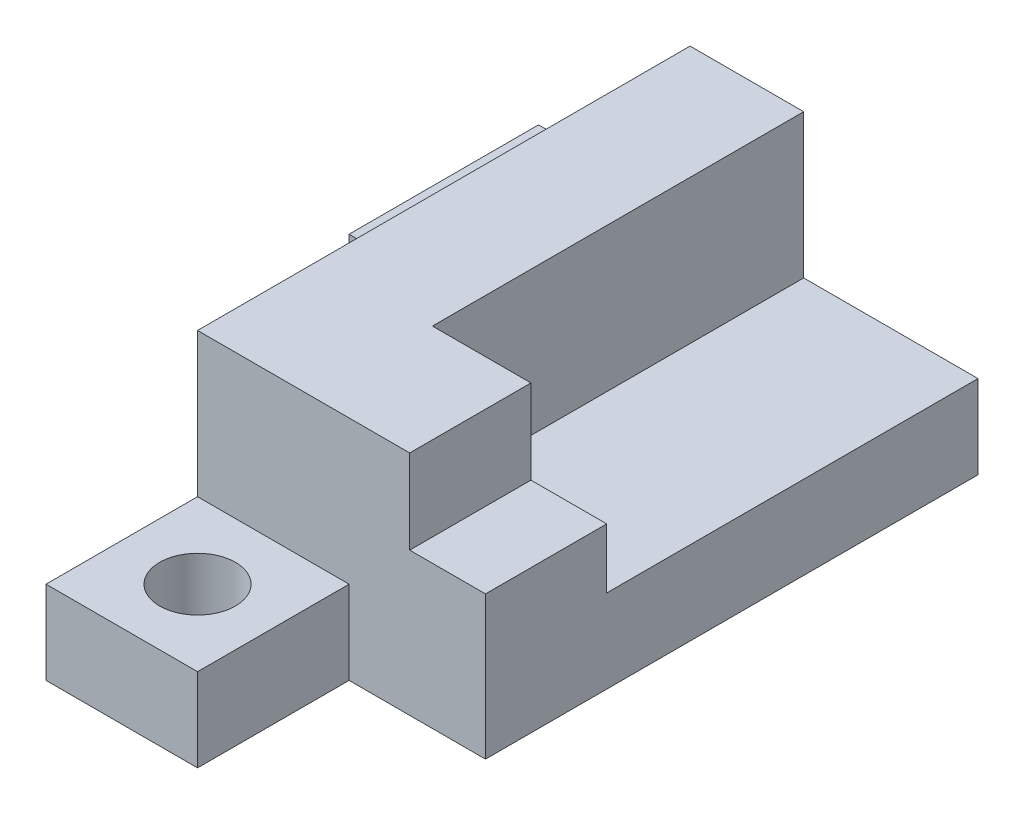
ISO-10303-21;
HEADER;
FILE_DESCRIPTION(('STEP AP214'),'2;1');
FILE_NAME('part.step','',(''),(''),'','','');
FILE_SCHEMA(('AUTOMOTIVE_DESIGN { 1 0 10303 214 1 1 1 1 }'));
ENDSEC;
DATA;
#1=APPLICATION_CONTEXT('core data for automotive mechanical design processes');
#2=APPLICATION_PROTOCOL_DEFINITION('international standard','automotive_design',2000,#1);
#3=PRODUCT_CONTEXT('',#1,'mechanical');
#4=PRODUCT('Part','Part','',(#3));
#5=PRODUCT_RELATED_PRODUCT_CATEGORY('part','',(#4));
#6=PRODUCT_DEFINITION_FORMATION('','',#4);
#7=PRODUCT_DEFINITION_CONTEXT('part definition',#1,'design');
#8=PRODUCT_DEFINITION('design','',#6,#7);
#9=PRODUCT_DEFINITION_SHAPE('','',#8);
#10=(LENGTH_UNIT() NAMED_UNIT(*) SI_UNIT(.MILLI.,.METRE.));
#11=(NAMED_UNIT(*) PLANE_ANGLE_UNIT() SI_UNIT($,.RADIAN.));
#12=(NAMED_UNIT(*) SI_UNIT($,.STERADIAN.) SOLID_ANGLE_UNIT());
#13=UNCERTAINTY_MEASURE_WITH_UNIT(LENGTH_MEASURE(1.E-05),#10,'distance_accuracy_value','');
#14=(GEOMETRIC_REPRESENTATION_CONTEXT(3) GLOBAL_UNCERTAINTY_ASSIGNED_CONTEXT((#13)) GLOBAL_UNIT_ASSIGNED_CONTEXT((#10,
#11,#12)) REPRESENTATION_CONTEXT('',''));
#15=CARTESIAN_POINT('',(0.,0.,0.));
#16=DIRECTION('',(0.,0.,1.));
#17=DIRECTION('',(1.,0.,0.));
#18=AXIS2_PLACEMENT_3D('',#15,#16,#17);
#19=CARTESIAN_POINT('',(-184.5,30.,-35.));
#20=DIRECTION('',(0.,0.,-1.));
#21=DIRECTION('',(-1.,0.,0.));
#22=AXIS2_PLACEMENT_3D('',#19,#20,#21);
#23=PLANE('',#22);
#24=DIRECTION('',(-1.,0.,0.));
#25=VECTOR('',#24,1.);
#26=CARTESIAN_POINT('',(-184.5,11.,-35.));
#27=LINE('',#26,#25);
#28=CARTESIAN_POINT('',(-164.5,11.,-35.));
#29=VERTEX_POINT('',#28);
#30=CARTESIAN_POINT('',(-184.5,11.,-35.));
#31=VERTEX_POINT('',#30);
#32=EDGE_CURVE('E269',#29,#31,#27,.T.);
#33=ORIENTED_EDGE('',*,*,#32,.F.);
#34=DIRECTION('',(0.,1.,0.));
#35=VECTOR('',#34,1.);
#36=CARTESIAN_POINT('',(-164.5,0.,-35.));
#37=LINE('',#36,#35);
#38=CARTESIAN_POINT('',(-164.5,0.,-35.));
#39=VERTEX_POINT('',#38);
#40=EDGE_CURVE('E54',#39,#29,#37,.T.);
#41=ORIENTED_EDGE('',*,*,#40,.F.);
#42=DIRECTION('',(1.,0.,0.));
#43=VECTOR('',#42,1.);
#44=CARTESIAN_POINT('',(0.,0.,-35.));
#45=LINE('',#44,#43);
#46=CARTESIAN_POINT('',(-146.5,0.,-35.));
#47=VERTEX_POINT('',#46);
#48=EDGE_CURVE('E219',#39,#47,#45,.T.);
#49=ORIENTED_EDGE('',*,*,#48,.T.);
#50=DIRECTION('',(0.,1.,0.));
#51=VECTOR('',#50,1.);
#52=CARTESIAN_POINT('',(-146.5,-190.,-35.));
#53=LINE('',#52,#51);
#54=CARTESIAN_POINT('',(-146.5,18.89,-35.));
#55=VERTEX_POINT('',#54);
#56=EDGE_CURVE('E217',#47,#55,#53,.T.);
#57=ORIENTED_EDGE('',*,*,#56,.T.);
#58=DIRECTION('',(1.,0.,0.));
#59=VECTOR('',#58,1.);
#60=CARTESIAN_POINT('',(-146.5,18.89,-35.));
#61=LINE('',#60,#59);
#62=CARTESIAN_POINT('',(-156.5,18.89,-35.));
#63=VERTEX_POINT('',#62);
#64=EDGE_CURVE('E203',#63,#55,#61,.T.);
#65=ORIENTED_EDGE('',*,*,#64,.F.);
#66=DIRECTION('',(0.,-1.,0.));
#67=VECTOR('',#66,1.);
#68=CARTESIAN_POINT('',(-156.5,30.,-35.));
#69=LINE('',#68,#67);
#70=CARTESIAN_POINT('',(-156.5,30.,-35.));
#71=VERTEX_POINT('',#70);
#72=EDGE_CURVE('E194',#71,#63,#69,.T.);
#73=ORIENTED_EDGE('',*,*,#72,.F.);
#74=DIRECTION('',(1.,0.,0.));
#75=VECTOR('',#74,1.);
#76=CARTESIAN_POINT('',(-184.5,30.,-35.));
#77=LINE('',#76,#75);
#78=CARTESIAN_POINT('',(-184.5,30.,-35.));
#79=VERTEX_POINT('',#78);
#80=EDGE_CURVE('E234',#79,#71,#77,.T.);
#81=ORIENTED_EDGE('',*,*,#80,.F.);
#82=DIRECTION('',(0.,-1.,0.));
#83=VECTOR('',#82,1.);
#84=CARTESIAN_POINT('',(-184.5,30.,-35.));
#85=LINE('',#84,#83);
#86=EDGE_CURVE('E60',#79,#31,#85,.T.);
#87=ORIENTED_EDGE('',*,*,#86,.T.);
#88=EDGE_LOOP('',(#33,#41,#49,#57,#65,#73,#81,#87));
#89=FACE_BOUND('',#88,.T.);
#90=ADVANCED_FACE('F39',(#89),#23,.F.);
#91=CARTESIAN_POINT('',(-184.5,20.,100.));
#92=DIRECTION('',(1.,0.,0.));
#93=DIRECTION('',(0.,0.,-1.));
#94=AXIS2_PLACEMENT_3D('',#91,#92,#93);
#95=PLANE('',#94);
#96=DIRECTION('',(0.,0.,-1.));
#97=VECTOR('',#96,1.);
#98=CARTESIAN_POINT('',(-184.5,11.,-75.));
#99=LINE('',#98,#97);
#100=CARTESIAN_POINT('',(-184.5,11.,-75.));
#101=VERTEX_POINT('',#100);
#102=CARTESIAN_POINT('',(-184.5,11.,-100.));
#103=VERTEX_POINT('',#102);
#104=EDGE_CURVE('E149',#101,#103,#99,.T.);
#105=ORIENTED_EDGE('',*,*,#104,.F.);
#106=DIRECTION('',(0.,1.,0.));
#107=VECTOR('',#106,1.);
#108=CARTESIAN_POINT('',(-184.5,0.,-75.));
#109=LINE('',#108,#107);
#110=CARTESIAN_POINT('',(-184.5,0.,-75.));
#111=VERTEX_POINT('',#110);
#112=EDGE_CURVE('E171',#111,#101,#109,.T.);
#113=ORIENTED_EDGE('',*,*,#112,.F.);
#114=DIRECTION('',(0.,0.,1.));
#115=VECTOR('',#114,1.);
#116=CARTESIAN_POINT('',(-184.5,0.,100.));
#117=LINE('',#116,#115);
#118=CARTESIAN_POINT('',(-184.5,0.,-15.));
#119=VERTEX_POINT('',#118);
#120=EDGE_CURVE('E155',#111,#119,#117,.T.);
#121=ORIENTED_EDGE('',*,*,#120,.T.);
#122=DIRECTION('',(0.,1.,0.));
#123=VECTOR('',#122,1.);
#124=CARTESIAN_POINT('',(-184.5,0.,-15.));
#125=LINE('',#124,#123);
#126=CARTESIAN_POINT('',(-184.5,11.,-15.));
#127=VERTEX_POINT('',#126);
#128=EDGE_CURVE('E240',#119,#127,#125,.T.);
#129=ORIENTED_EDGE('',*,*,#128,.T.);
#130=DIRECTION('',(0.,0.,1.));
#131=VECTOR('',#130,1.);
#132=CARTESIAN_POINT('',(-184.5,11.,-35.));
#133=LINE('',#132,#131);
#134=EDGE_CURVE('E272',#31,#127,#133,.T.);
#135=ORIENTED_EDGE('',*,*,#134,.F.);
#136=ORIENTED_EDGE('',*,*,#86,.F.);
#137=DIRECTION('',(0.,0.,1.));
#138=VECTOR('',#137,1.);
#139=CARTESIAN_POINT('',(-184.5,30.,-100.));
#140=LINE('',#139,#138);
#141=CARTESIAN_POINT('',(-184.5,30.,-100.));
#142=VERTEX_POINT('',#141);
#143=EDGE_CURVE('E152',#142,#79,#140,.T.);
#144=ORIENTED_EDGE('',*,*,#143,.F.);
#145=DIRECTION('',(0.,-1.,0.));
#146=VECTOR('',#145,1.);
#147=CARTESIAN_POINT('',(-184.5,20.,-100.));
#148=LINE('',#147,#146);
#149=EDGE_CURVE('E47',#142,#103,#148,.T.);
#150=ORIENTED_EDGE('',*,*,#149,.T.);
#151=EDGE_LOOP('',(#105,#113,#121,#129,#135,#136,#144,#150));
#152=FACE_BOUND('',#151,.T.);
#153=ADVANCED_FACE('F146',(#152),#95,.F.);
#154=CARTESIAN_POINT('',(-184.5,20.,-100.));
#155=DIRECTION('',(0.,0.,1.));
#156=DIRECTION('',(1.,0.,0.));
#157=AXIS2_PLACEMENT_3D('',#154,#155,#156);
#158=PLANE('',#157);
#159=DIRECTION('',(1.,0.,0.));
#160=VECTOR('',#159,1.);
#161=CARTESIAN_POINT('',(-146.5,11.,-100.));
#162=LINE('',#161,#160);
#163=CARTESIAN_POINT('',(-169.5,11.,-100.));
#164=VERTEX_POINT('',#163);
#165=CARTESIAN_POINT('',(-146.5,11.,-100.));
#166=VERTEX_POINT('',#165);
#167=EDGE_CURVE('E188',#164,#166,#162,.T.);
#168=ORIENTED_EDGE('',*,*,#167,.T.);
#169=DIRECTION('',(0.,-1.,0.));
#170=VECTOR('',#169,1.);
#171=CARTESIAN_POINT('',(-146.5,20.,-100.));
#172=LINE('',#171,#170);
#173=CARTESIAN_POINT('',(-146.5,0.,-100.));
#174=VERTEX_POINT('',#173);
#175=EDGE_CURVE('E224',#166,#174,#172,.T.);
#176=ORIENTED_EDGE('',*,*,#175,.T.);
#177=DIRECTION('',(-1.,0.,0.));
#178=VECTOR('',#177,1.);
#179=CARTESIAN_POINT('',(-184.5,0.,-100.));
#180=LINE('',#179,#178);
#181=CARTESIAN_POINT('',(-204.5,0.,-100.));
#182=VERTEX_POINT('',#181);
#183=EDGE_CURVE('E237',#174,#182,#180,.T.);
#184=ORIENTED_EDGE('',*,*,#183,.T.);
#185=DIRECTION('',(0.,-1.,0.));
#186=VECTOR('',#185,1.);
#187=CARTESIAN_POINT('',(-204.5,11.,-100.));
#188=LINE('',#187,#186);
#189=CARTESIAN_POINT('',(-204.5,11.,-100.));
#190=VERTEX_POINT('',#189);
#191=EDGE_CURVE('E160',#190,#182,#188,.T.);
#192=ORIENTED_EDGE('',*,*,#191,.F.);
#193=DIRECTION('',(1.,0.,0.));
#194=VECTOR('',#193,1.);
#195=CARTESIAN_POINT('',(-204.5,11.,-100.));
#196=LINE('',#195,#194);
#197=EDGE_CURVE('E157',#190,#103,#196,.T.);
#198=ORIENTED_EDGE('',*,*,#197,.T.);
#199=ORIENTED_EDGE('',*,*,#149,.F.);
#200=DIRECTION('',(-1.,0.,0.));
#201=VECTOR('',#200,1.);
#202=CARTESIAN_POINT('',(-169.5,30.,-100.));
#203=LINE('',#202,#201);
#204=CARTESIAN_POINT('',(-169.5,30.,-100.));
#205=VERTEX_POINT('',#204);
#206=EDGE_CURVE('E230',#205,#142,#203,.T.);
#207=ORIENTED_EDGE('',*,*,#206,.F.);
#208=DIRECTION('',(0.,1.,0.));
#209=VECTOR('',#208,1.);
#210=CARTESIAN_POINT('',(-169.5,-5.76305461424021,-100.));
#211=LINE('',#210,#209);
#212=EDGE_CURVE('E164',#164,#205,#211,.T.);
#213=ORIENTED_EDGE('',*,*,#212,.F.);
#214=EDGE_LOOP('',(#168,#176,#184,#192,#198,#199,#207,#213));
#215=FACE_BOUND('',#214,.T.);
#216=ADVANCED_FACE('F41',(#215),#158,.F.);
#217=CARTESIAN_POINT('',(0.,30.,0.));
#218=DIRECTION('',(0.,1.,0.));
#219=DIRECTION('',(0.,0.,1.));
#220=AXIS2_PLACEMENT_3D('',#217,#218,#219);
#221=PLANE('',#220);
#222=DIRECTION('',(0.,0.,-1.));
#223=VECTOR('',#222,1.);
#224=CARTESIAN_POINT('',(-169.5,30.,-84.));
#225=LINE('',#224,#223);
#226=CARTESIAN_POINT('',(-169.5,30.,-51.));
#227=VERTEX_POINT('',#226);
#228=EDGE_CURVE('E232',#227,#205,#225,.T.);
#229=ORIENTED_EDGE('',*,*,#228,.T.);
#230=ORIENTED_EDGE('',*,*,#206,.T.);
#231=ORIENTED_EDGE('',*,*,#143,.T.);
#232=ORIENTED_EDGE('',*,*,#80,.T.);
#233=DIRECTION('',(0.,0.,1.));
#234=VECTOR('',#233,1.);
#235=CARTESIAN_POINT('',(-156.5,30.,-51.));
#236=LINE('',#235,#234);
#237=CARTESIAN_POINT('',(-156.5,30.,-51.));
#238=VERTEX_POINT('',#237);
#239=EDGE_CURVE('E191',#238,#71,#236,.T.);
#240=ORIENTED_EDGE('',*,*,#239,.F.);
#241=DIRECTION('',(-1.,0.,0.));
#242=VECTOR('',#241,1.);
#243=CARTESIAN_POINT('',(-156.5,30.,-51.));
#244=LINE('',#243,#242);
#245=EDGE_CURVE('E198',#238,#227,#244,.T.);
#246=ORIENTED_EDGE('',*,*,#245,.T.);
#247=EDGE_LOOP('',(#229,#230,#231,#232,#240,#246));
#248=FACE_BOUND('',#247,.T.);
#249=ADVANCED_FACE('F324',(#248),#221,.T.);
#250=CARTESIAN_POINT('',(-146.5,-39.,-161.504576805052));
#251=DIRECTION('',(-1.,0.,0.));
#252=DIRECTION('',(0.,0.,1.));
#253=AXIS2_PLACEMENT_3D('',#250,#251,#252);
#254=PLANE('',#253);
#255=ORIENTED_EDGE('',*,*,#175,.F.);
#256=DIRECTION('',(0.,0.,1.));
#257=VECTOR('',#256,1.);
#258=CARTESIAN_POINT('',(-146.5,11.,0.));
#259=LINE('',#258,#257);
#260=CARTESIAN_POINT('',(-146.5,11.,-51.));
#261=VERTEX_POINT('',#260);
#262=EDGE_CURVE('E11',#166,#261,#259,.T.);
#263=ORIENTED_EDGE('',*,*,#262,.T.);
#264=DIRECTION('',(0.,-1.,0.));
#265=VECTOR('',#264,1.);
#266=CARTESIAN_POINT('',(-146.5,18.89,-51.));
#267=LINE('',#266,#265);
#268=CARTESIAN_POINT('',(-146.5,18.89,-51.));
#269=VERTEX_POINT('',#268);
#270=EDGE_CURVE('E214',#269,#261,#267,.T.);
#271=ORIENTED_EDGE('',*,*,#270,.F.);
#272=DIRECTION('',(0.,0.,-1.));
#273=VECTOR('',#272,1.);
#274=CARTESIAN_POINT('',(-146.5,18.89,-51.));
#275=LINE('',#274,#273);
#276=EDGE_CURVE('E206',#55,#269,#275,.T.);
#277=ORIENTED_EDGE('',*,*,#276,.F.);
#278=ORIENTED_EDGE('',*,*,#56,.F.);
#279=DIRECTION('',(0.,0.,-1.));
#280=VECTOR('',#279,1.);
#281=CARTESIAN_POINT('',(-146.5,0.,0.));
#282=LINE('',#281,#280);
#283=EDGE_CURVE('E221',#47,#174,#282,.T.);
#284=ORIENTED_EDGE('',*,*,#283,.T.);
#285=EDGE_LOOP('',(#255,#263,#271,#277,#278,#284));
#286=FACE_BOUND('',#285,.T.);
#287=ADVANCED_FACE('F293',(#286),#254,.F.);
#288=CARTESIAN_POINT('',(-169.5,30.,84.));
#289=DIRECTION('',(-1.,0.,0.));
#290=DIRECTION('',(0.,0.,1.));
#291=AXIS2_PLACEMENT_3D('',#288,#289,#290);
#292=PLANE('',#291);
#293=DIRECTION('',(0.,1.,0.));
#294=VECTOR('',#293,1.);
#295=CARTESIAN_POINT('',(-169.5,11.,-51.));
#296=LINE('',#295,#294);
#297=CARTESIAN_POINT('',(-169.5,11.,-51.));
#298=VERTEX_POINT('',#297);
#299=EDGE_CURVE('E190',#298,#227,#296,.T.);
#300=ORIENTED_EDGE('',*,*,#299,.F.);
#301=DIRECTION('',(0.,0.,1.));
#302=VECTOR('',#301,1.);
#303=CARTESIAN_POINT('',(-169.5,11.,-84.));
#304=LINE('',#303,#302);
#305=EDGE_CURVE('E226',#164,#298,#304,.T.);
#306=ORIENTED_EDGE('',*,*,#305,.F.);
#307=ORIENTED_EDGE('',*,*,#212,.T.);
#308=ORIENTED_EDGE('',*,*,#228,.F.);
#309=EDGE_LOOP('',(#300,#306,#307,#308));
#310=FACE_BOUND('',#309,.T.);
#311=ADVANCED_FACE('F328',(#310),#292,.F.);
#312=CARTESIAN_POINT('',(0.,0.,0.));
#313=DIRECTION('',(0.,-1.,0.));
#314=DIRECTION('',(0.,0.,-1.));
#315=AXIS2_PLACEMENT_3D('',#312,#313,#314);
#316=PLANE('',#315);
#317=CARTESIAN_POINT('',(-174.5,0.,-25.));
#318=DIRECTION('',(0.,1.,0.));
#319=DIRECTION('',(0.,0.,1.));
#320=AXIS2_PLACEMENT_3D('',#317,#318,#319);
#321=CIRCLE('',#320,4.99999999999999);
#322=CARTESIAN_POINT('',(-174.5,0.,-20.));
#323=VERTEX_POINT('',#322);
#324=EDGE_CURVE('E273',#323,#323,#321,.T.);
#325=ORIENTED_EDGE('',*,*,#324,.T.);
#326=EDGE_LOOP('',(#325));
#327=FACE_BOUND('',#326,.T.);
#328=DIRECTION('',(0.,0.,1.));
#329=VECTOR('',#328,1.);
#330=CARTESIAN_POINT('',(-204.5,0.,-100.));
#331=LINE('',#330,#329);
#332=CARTESIAN_POINT('',(-204.5,0.,-75.));
#333=VERTEX_POINT('',#332);
#334=EDGE_CURVE('E281',#182,#333,#331,.T.);
#335=ORIENTED_EDGE('',*,*,#334,.F.);
#336=ORIENTED_EDGE('',*,*,#183,.F.);
#337=ORIENTED_EDGE('',*,*,#283,.F.);
#338=ORIENTED_EDGE('',*,*,#48,.F.);
#339=DIRECTION('',(0.,0.,-1.));
#340=VECTOR('',#339,1.);
#341=CARTESIAN_POINT('',(-164.5,0.,-35.));
#342=LINE('',#341,#340);
#343=CARTESIAN_POINT('',(-164.5,0.,-15.));
#344=VERTEX_POINT('',#343);
#345=EDGE_CURVE('E254',#344,#39,#342,.T.);
#346=ORIENTED_EDGE('',*,*,#345,.F.);
#347=DIRECTION('',(1.,0.,0.));
#348=VECTOR('',#347,1.);
#349=CARTESIAN_POINT('',(-184.5,0.,-15.));
#350=LINE('',#349,#348);
#351=EDGE_CURVE('E248',#119,#344,#350,.T.);
#352=ORIENTED_EDGE('',*,*,#351,.F.);
#353=ORIENTED_EDGE('',*,*,#120,.F.);
#354=DIRECTION('',(1.,0.,0.));
#355=VECTOR('',#354,1.);
#356=CARTESIAN_POINT('',(-204.5,0.,-75.));
#357=LINE('',#356,#355);
#358=EDGE_CURVE('E165',#333,#111,#357,.T.);
#359=ORIENTED_EDGE('',*,*,#358,.F.);
#360=EDGE_LOOP('',(#335,#336,#337,#338,#346,#352,#353,#359));
#361=FACE_BOUND('',#360,.T.);
#362=CARTESIAN_POINT('',(-194.5,0.,-87.5));
#363=DIRECTION('',(0.,1.,0.));
#364=DIRECTION('',(0.,0.,1.));
#365=AXIS2_PLACEMENT_3D('',#362,#363,#364);
#366=CIRCLE('',#365,4.99999999999999);
#367=CARTESIAN_POINT('',(-194.5,0.,-82.5));
#368=VERTEX_POINT('',#367);
#369=EDGE_CURVE('E172',#368,#368,#366,.T.);
#370=ORIENTED_EDGE('',*,*,#369,.T.);
#371=EDGE_LOOP('',(#370));
#372=FACE_BOUND('',#371,.T.);
#373=ADVANCED_FACE('F257',(#327,#361,#372),#316,.T.);
#374=CARTESIAN_POINT('',(-184.5,11.,-120.));
#375=DIRECTION('',(0.,-1.,0.));
#376=DIRECTION('',(0.,0.,-1.));
#377=AXIS2_PLACEMENT_3D('',#374,#375,#376);
#378=PLANE('',#377);
#379=ORIENTED_EDGE('',*,*,#167,.F.);
#380=ORIENTED_EDGE('',*,*,#305,.T.);
#381=DIRECTION('',(-1.,0.,0.));
#382=VECTOR('',#381,1.);
#383=CARTESIAN_POINT('',(-156.5,11.,-51.));
#384=LINE('',#383,#382);
#385=EDGE_CURVE('E202',#261,#298,#384,.T.);
#386=ORIENTED_EDGE('',*,*,#385,.F.);
#387=ORIENTED_EDGE('',*,*,#262,.F.);
#388=EDGE_LOOP('',(#379,#380,#386,#387));
#389=FACE_BOUND('',#388,.T.);
#390=ADVANCED_FACE('F333',(#389),#378,.F.);
#391=CARTESIAN_POINT('',(-156.5,18.89,-51.));
#392=DIRECTION('',(0.,0.,1.));
#393=DIRECTION('',(1.,0.,0.));
#394=AXIS2_PLACEMENT_3D('',#391,#392,#393);
#395=PLANE('',#394);
#396=ORIENTED_EDGE('',*,*,#385,.T.);
#397=ORIENTED_EDGE('',*,*,#299,.T.);
#398=ORIENTED_EDGE('',*,*,#245,.F.);
#399=DIRECTION('',(0.,1.,0.));
#400=VECTOR('',#399,1.);
#401=CARTESIAN_POINT('',(-156.5,11.,-51.));
#402=LINE('',#401,#400);
#403=CARTESIAN_POINT('',(-156.5,18.89,-51.));
#404=VERTEX_POINT('',#403);
#405=EDGE_CURVE('E196',#404,#238,#402,.T.);
#406=ORIENTED_EDGE('',*,*,#405,.F.);
#407=DIRECTION('',(-1.,0.,0.));
#408=VECTOR('',#407,1.);
#409=CARTESIAN_POINT('',(-156.5,18.89,-51.));
#410=LINE('',#409,#408);
#411=EDGE_CURVE('E208',#269,#404,#410,.T.);
#412=ORIENTED_EDGE('',*,*,#411,.F.);
#413=ORIENTED_EDGE('',*,*,#270,.T.);
#414=EDGE_LOOP('',(#396,#397,#398,#406,#412,#413));
#415=FACE_BOUND('',#414,.T.);
#416=ADVANCED_FACE('F338',(#415),#395,.F.);
#417=CARTESIAN_POINT('',(0.,18.89,0.));
#418=DIRECTION('',(0.,-1.,0.));
#419=DIRECTION('',(0.,0.,-1.));
#420=AXIS2_PLACEMENT_3D('',#417,#418,#419);
#421=PLANE('',#420);
#422=ORIENTED_EDGE('',*,*,#64,.T.);
#423=ORIENTED_EDGE('',*,*,#276,.T.);
#424=ORIENTED_EDGE('',*,*,#411,.T.);
#425=DIRECTION('',(0.,0.,1.));
#426=VECTOR('',#425,1.);
#427=CARTESIAN_POINT('',(-156.5,18.89,-35.));
#428=LINE('',#427,#426);
#429=EDGE_CURVE('E211',#404,#63,#428,.T.);
#430=ORIENTED_EDGE('',*,*,#429,.T.);
#431=EDGE_LOOP('',(#422,#423,#424,#430));
#432=FACE_BOUND('',#431,.T.);
#433=ADVANCED_FACE('F347',(#432),#421,.F.);
#434=CARTESIAN_POINT('',(-156.5,0.,0.));
#435=DIRECTION('',(1.,0.,0.));
#436=DIRECTION('',(0.,0.,-1.));
#437=AXIS2_PLACEMENT_3D('',#434,#435,#436);
#438=PLANE('',#437);
#439=ORIENTED_EDGE('',*,*,#429,.F.);
#440=ORIENTED_EDGE('',*,*,#405,.T.);
#441=ORIENTED_EDGE('',*,*,#239,.T.);
#442=ORIENTED_EDGE('',*,*,#72,.T.);
#443=EDGE_LOOP('',(#439,#440,#441,#442));
#444=FACE_BOUND('',#443,.T.);
#445=ADVANCED_FACE('F353',(#444),#438,.T.);
#446=CARTESIAN_POINT('',(-204.5,11.,-75.));
#447=DIRECTION('',(0.,-1.,0.));
#448=DIRECTION('',(0.,0.,-1.));
#449=AXIS2_PLACEMENT_3D('',#446,#447,#448);
#450=PLANE('',#449);
#451=CARTESIAN_POINT('',(-194.5,11.,-87.5));
#452=DIRECTION('',(0.,1.,0.));
#453=DIRECTION('',(0.,0.,1.));
#454=AXIS2_PLACEMENT_3D('',#451,#452,#453);
#455=CIRCLE('',#454,4.99999999999999);
#456=CARTESIAN_POINT('',(-194.5,11.,-82.5));
#457=VERTEX_POINT('',#456);
#458=EDGE_CURVE('E177',#457,#457,#455,.T.);
#459=ORIENTED_EDGE('',*,*,#458,.F.);
#460=EDGE_LOOP('',(#459));
#461=FACE_BOUND('',#460,.T.);
#462=ORIENTED_EDGE('',*,*,#104,.T.);
#463=ORIENTED_EDGE('',*,*,#197,.F.);
#464=DIRECTION('',(0.,0.,-1.));
#465=VECTOR('',#464,1.);
#466=CARTESIAN_POINT('',(-204.5,11.,-75.));
#467=LINE('',#466,#465);
#468=CARTESIAN_POINT('',(-204.5,11.,-75.));
#469=VERTEX_POINT('',#468);
#470=EDGE_CURVE('E174',#469,#190,#467,.T.);
#471=ORIENTED_EDGE('',*,*,#470,.F.);
#472=DIRECTION('',(1.,0.,0.));
#473=VECTOR('',#472,1.);
#474=CARTESIAN_POINT('',(-204.5,11.,-75.));
#475=LINE('',#474,#473);
#476=EDGE_CURVE('E170',#469,#101,#475,.T.);
#477=ORIENTED_EDGE('',*,*,#476,.T.);
#478=EDGE_LOOP('',(#462,#463,#471,#477));
#479=FACE_BOUND('',#478,.T.);
#480=ADVANCED_FACE('F168',(#461,#479),#450,.F.);
#481=CARTESIAN_POINT('',(-204.5,0.,-75.));
#482=DIRECTION('',(0.,0.,-1.));
#483=DIRECTION('',(-1.,0.,0.));
#484=AXIS2_PLACEMENT_3D('',#481,#482,#483);
#485=PLANE('',#484);
#486=ORIENTED_EDGE('',*,*,#112,.T.);
#487=ORIENTED_EDGE('',*,*,#476,.F.);
#488=DIRECTION('',(0.,1.,0.));
#489=VECTOR('',#488,1.);
#490=CARTESIAN_POINT('',(-204.5,0.,-75.));
#491=LINE('',#490,#489);
#492=EDGE_CURVE('E180',#333,#469,#491,.T.);
#493=ORIENTED_EDGE('',*,*,#492,.F.);
#494=ORIENTED_EDGE('',*,*,#358,.T.);
#495=EDGE_LOOP('',(#486,#487,#493,#494));
#496=FACE_BOUND('',#495,.T.);
#497=ADVANCED_FACE('F286',(#496),#485,.F.);
#498=CARTESIAN_POINT('',(-204.5,0.,0.));
#499=DIRECTION('',(-1.,0.,0.));
#500=DIRECTION('',(0.,0.,1.));
#501=AXIS2_PLACEMENT_3D('',#498,#499,#500);
#502=PLANE('',#501);
#503=ORIENTED_EDGE('',*,*,#470,.T.);
#504=ORIENTED_EDGE('',*,*,#191,.T.);
#505=ORIENTED_EDGE('',*,*,#334,.T.);
#506=ORIENTED_EDGE('',*,*,#492,.T.);
#507=EDGE_LOOP('',(#503,#504,#505,#506));
#508=FACE_BOUND('',#507,.T.);
#509=ADVANCED_FACE('F284',(#508),#502,.T.);
#510=CARTESIAN_POINT('',(-194.5,0.,-87.5));
#511=DIRECTION('',(0.,1.,0.));
#512=DIRECTION('',(0.,0.,1.));
#513=AXIS2_PLACEMENT_3D('',#510,#511,#512);
#514=CYLINDRICAL_SURFACE('',#513,4.99999999999999);
#515=ORIENTED_EDGE('',*,*,#369,.F.);
#516=EDGE_LOOP('',(#515));
#517=FACE_BOUND('',#516,.T.);
#518=ORIENTED_EDGE('',*,*,#458,.T.);
#519=EDGE_LOOP('',(#518));
#520=FACE_BOUND('',#519,.T.);
#521=ADVANCED_FACE('F365',(#517,#520),#514,.F.);
#522=CARTESIAN_POINT('',(-164.5,0.,-35.));
#523=DIRECTION('',(1.,0.,0.));
#524=DIRECTION('',(0.,0.,-1.));
#525=AXIS2_PLACEMENT_3D('',#522,#523,#524);
#526=PLANE('',#525);
#527=DIRECTION('',(0.,0.,-1.));
#528=VECTOR('',#527,1.);
#529=CARTESIAN_POINT('',(-164.5,11.,-35.));
#530=LINE('',#529,#528);
#531=CARTESIAN_POINT('',(-164.5,11.,-15.));
#532=VERTEX_POINT('',#531);
#533=EDGE_CURVE('E260',#532,#29,#530,.T.);
#534=ORIENTED_EDGE('',*,*,#533,.F.);
#535=DIRECTION('',(0.,1.,0.));
#536=VECTOR('',#535,1.);
#537=CARTESIAN_POINT('',(-164.5,0.,-15.));
#538=LINE('',#537,#536);
#539=EDGE_CURVE('E253',#344,#532,#538,.T.);
#540=ORIENTED_EDGE('',*,*,#539,.F.);
#541=ORIENTED_EDGE('',*,*,#345,.T.);
#542=ORIENTED_EDGE('',*,*,#40,.T.);
#543=EDGE_LOOP('',(#534,#540,#541,#542));
#544=FACE_BOUND('',#543,.T.);
#545=ADVANCED_FACE('F300',(#544),#526,.T.);
#546=CARTESIAN_POINT('',(-184.5,0.,-15.));
#547=DIRECTION('',(0.,0.,1.));
#548=DIRECTION('',(1.,0.,0.));
#549=AXIS2_PLACEMENT_3D('',#546,#547,#548);
#550=PLANE('',#549);
#551=DIRECTION('',(1.,0.,0.));
#552=VECTOR('',#551,1.);
#553=CARTESIAN_POINT('',(-184.5,11.,-15.));
#554=LINE('',#553,#552);
#555=EDGE_CURVE('E251',#127,#532,#554,.T.);
#556=ORIENTED_EDGE('',*,*,#555,.F.);
#557=ORIENTED_EDGE('',*,*,#128,.F.);
#558=ORIENTED_EDGE('',*,*,#351,.T.);
#559=ORIENTED_EDGE('',*,*,#539,.T.);
#560=EDGE_LOOP('',(#556,#557,#558,#559));
#561=FACE_BOUND('',#560,.T.);
#562=ADVANCED_FACE('F247',(#561),#550,.T.);
#563=CARTESIAN_POINT('',(0.,11.,0.));
#564=DIRECTION('',(0.,-1.,0.));
#565=DIRECTION('',(0.,0.,-1.));
#566=AXIS2_PLACEMENT_3D('',#563,#564,#565);
#567=PLANE('',#566);
#568=CARTESIAN_POINT('',(-174.5,11.,-25.));
#569=DIRECTION('',(0.,1.,0.));
#570=DIRECTION('',(0.,0.,1.));
#571=AXIS2_PLACEMENT_3D('',#568,#569,#570);
#572=CIRCLE('',#571,4.99999999999999);
#573=CARTESIAN_POINT('',(-174.5,11.,-20.));
#574=VERTEX_POINT('',#573);
#575=EDGE_CURVE('E266',#574,#574,#572,.T.);
#576=ORIENTED_EDGE('',*,*,#575,.F.);
#577=EDGE_LOOP('',(#576));
#578=FACE_BOUND('',#577,.T.);
#579=ORIENTED_EDGE('',*,*,#32,.T.);
#580=ORIENTED_EDGE('',*,*,#134,.T.);
#581=ORIENTED_EDGE('',*,*,#555,.T.);
#582=ORIENTED_EDGE('',*,*,#533,.T.);
#583=EDGE_LOOP('',(#579,#580,#581,#582));
#584=FACE_BOUND('',#583,.T.);
#585=ADVANCED_FACE('F302',(#578,#584),#567,.F.);
#586=CARTESIAN_POINT('',(-174.5,0.,-25.));
#587=DIRECTION('',(0.,1.,0.));
#588=DIRECTION('',(0.,0.,1.));
#589=AXIS2_PLACEMENT_3D('',#586,#587,#588);
#590=CYLINDRICAL_SURFACE('',#589,4.99999999999999);
#591=ORIENTED_EDGE('',*,*,#324,.F.);
#592=EDGE_LOOP('',(#591));
#593=FACE_BOUND('',#592,.T.);
#594=ORIENTED_EDGE('',*,*,#575,.T.);
#595=EDGE_LOOP('',(#594));
#596=FACE_BOUND('',#595,.T.);
#597=ADVANCED_FACE('F304',(#593,#596),#590,.F.);
#598=CLOSED_SHELL('',(#90,#153,#216,#249,#287,#311,#373,#390,#416,#433,#445,#480,#497,#509,#521,
#545,#562,#585,#597));
#599=MANIFOLD_SOLID_BREP('B2',#598);
#600=ADVANCED_BREP_SHAPE_REPRESENTATION('',(#18,#599),#14);
#601=SHAPE_DEFINITION_REPRESENTATION(#9,#600);
ENDSEC;
END-ISO-10303-21;
